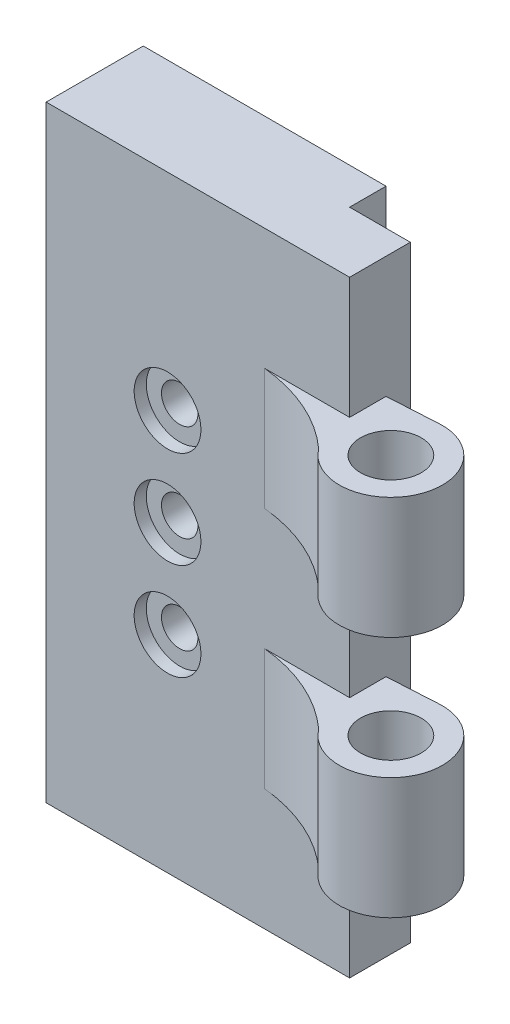
ISO-10303-21;
HEADER;
FILE_DESCRIPTION(('STEP AP214'),'2;1');
FILE_NAME('part.step','',(''),(''),'','','');
FILE_SCHEMA(('AUTOMOTIVE_DESIGN { 1 0 10303 214 1 1 1 1 }'));
ENDSEC;
DATA;
#1=APPLICATION_CONTEXT('core data for automotive mechanical design processes');
#2=APPLICATION_PROTOCOL_DEFINITION('international standard','automotive_design',2000,#1);
#3=PRODUCT_CONTEXT('',#1,'mechanical');
#4=PRODUCT('Part','Part','',(#3));
#5=PRODUCT_RELATED_PRODUCT_CATEGORY('part','',(#4));
#6=PRODUCT_DEFINITION_FORMATION('','',#4);
#7=PRODUCT_DEFINITION_CONTEXT('part definition',#1,'design');
#8=PRODUCT_DEFINITION('design','',#6,#7);
#9=PRODUCT_DEFINITION_SHAPE('','',#8);
#10=(LENGTH_UNIT() NAMED_UNIT(*) SI_UNIT(.MILLI.,.METRE.));
#11=(NAMED_UNIT(*) PLANE_ANGLE_UNIT() SI_UNIT($,.RADIAN.));
#12=(NAMED_UNIT(*) SI_UNIT($,.STERADIAN.) SOLID_ANGLE_UNIT());
#13=UNCERTAINTY_MEASURE_WITH_UNIT(LENGTH_MEASURE(1.E-05),#10,'distance_accuracy_value','');
#14=(GEOMETRIC_REPRESENTATION_CONTEXT(3) GLOBAL_UNCERTAINTY_ASSIGNED_CONTEXT((#13)) GLOBAL_UNIT_ASSIGNED_CONTEXT((#10,
#11,#12)) REPRESENTATION_CONTEXT('',''));
#15=CARTESIAN_POINT('',(0.,0.,0.));
#16=DIRECTION('',(0.,0.,1.));
#17=DIRECTION('',(1.,0.,0.));
#18=AXIS2_PLACEMENT_3D('',#15,#16,#17);
#19=CARTESIAN_POINT('',(-17.5,-50.,-5.));
#20=DIRECTION('',(0.,0.,1.));
#21=DIRECTION('',(1.,0.,0.));
#22=AXIS2_PLACEMENT_3D('',#19,#20,#21);
#23=PLANE('',#22);
#24=DIRECTION('',(0.,-1.,0.));
#25=VECTOR('',#24,1.);
#26=CARTESIAN_POINT('',(-5.,-50.,-5.));
#27=LINE('',#26,#25);
#28=CARTESIAN_POINT('',(-5.,0.,-5.));
#29=VERTEX_POINT('',#28);
#30=CARTESIAN_POINT('',(-5.,-50.,-5.));
#31=VERTEX_POINT('',#30);
#32=EDGE_CURVE('E56',#29,#31,#27,.T.);
#33=ORIENTED_EDGE('',*,*,#32,.F.);
#34=DIRECTION('',(1.,0.,0.));
#35=VECTOR('',#34,1.);
#36=CARTESIAN_POINT('',(-17.5,0.,-5.));
#37=LINE('',#36,#35);
#38=CARTESIAN_POINT('',(0.,0.,-5.));
#39=VERTEX_POINT('',#38);
#40=EDGE_CURVE('E232',#29,#39,#37,.T.);
#41=ORIENTED_EDGE('',*,*,#40,.T.);
#42=DIRECTION('',(0.,1.,0.));
#43=VECTOR('',#42,1.);
#44=CARTESIAN_POINT('',(0.,-50.,-5.));
#45=LINE('',#44,#43);
#46=CARTESIAN_POINT('',(0.,-50.,-5.));
#47=VERTEX_POINT('',#46);
#48=EDGE_CURVE('E181',#47,#39,#45,.T.);
#49=ORIENTED_EDGE('',*,*,#48,.F.);
#50=DIRECTION('',(1.,0.,0.));
#51=VECTOR('',#50,1.);
#52=CARTESIAN_POINT('',(-17.5,-50.,-5.));
#53=LINE('',#52,#51);
#54=EDGE_CURVE('E240',#31,#47,#53,.T.);
#55=ORIENTED_EDGE('',*,*,#54,.F.);
#56=EDGE_LOOP('',(#33,#41,#49,#55));
#57=FACE_BOUND('',#56,.T.);
#58=ADVANCED_FACE('F39',(#57),#23,.F.);
#59=CARTESIAN_POINT('',(-17.5,-50.,0.));
#60=DIRECTION('',(0.,0.,-1.));
#61=DIRECTION('',(-1.,0.,0.));
#62=AXIS2_PLACEMENT_3D('',#59,#60,#61);
#63=PLANE('',#62);
#64=CARTESIAN_POINT('',(-15.,-17.,0.));
#65=DIRECTION('',(0.,0.,1.));
#66=DIRECTION('',(1.,0.,0.));
#67=AXIS2_PLACEMENT_3D('',#64,#65,#66);
#68=CIRCLE('',#67,2.75);
#69=CARTESIAN_POINT('',(-12.25,-17.,0.));
#70=VERTEX_POINT('',#69);
#71=EDGE_CURVE('E11',#70,#70,#68,.T.);
#72=ORIENTED_EDGE('',*,*,#71,.F.);
#73=EDGE_LOOP('',(#72));
#74=FACE_BOUND('',#73,.T.);
#75=CARTESIAN_POINT('',(-15.,-25.,0.));
#76=DIRECTION('',(0.,0.,1.));
#77=DIRECTION('',(1.,0.,0.));
#78=AXIS2_PLACEMENT_3D('',#75,#76,#77);
#79=CIRCLE('',#78,2.75);
#80=CARTESIAN_POINT('',(-12.25,-25.,0.));
#81=VERTEX_POINT('',#80);
#82=EDGE_CURVE('E48',#81,#81,#79,.T.);
#83=ORIENTED_EDGE('',*,*,#82,.F.);
#84=EDGE_LOOP('',(#83));
#85=FACE_BOUND('',#84,.T.);
#86=CARTESIAN_POINT('',(-15.,-33.,0.));
#87=DIRECTION('',(0.,0.,1.));
#88=DIRECTION('',(1.,0.,0.));
#89=AXIS2_PLACEMENT_3D('',#86,#87,#88);
#90=CIRCLE('',#89,2.75);
#91=CARTESIAN_POINT('',(-12.25,-33.,0.));
#92=VERTEX_POINT('',#91);
#93=EDGE_CURVE('E306',#92,#92,#90,.T.);
#94=ORIENTED_EDGE('',*,*,#93,.F.);
#95=EDGE_LOOP('',(#94));
#96=FACE_BOUND('',#95,.T.);
#97=DIRECTION('',(-1.,0.,0.));
#98=VECTOR('',#97,1.);
#99=CARTESIAN_POINT('',(-17.5,0.,0.));
#100=LINE('',#99,#98);
#101=CARTESIAN_POINT('',(0.,0.,0.));
#102=VERTEX_POINT('',#101);
#103=CARTESIAN_POINT('',(-25.,0.,0.));
#104=VERTEX_POINT('',#103);
#105=EDGE_CURVE('E64',#102,#104,#100,.T.);
#106=ORIENTED_EDGE('',*,*,#105,.T.);
#107=DIRECTION('',(0.,-1.,0.));
#108=VECTOR('',#107,1.);
#109=CARTESIAN_POINT('',(-25.,-25.,0.));
#110=LINE('',#109,#108);
#111=CARTESIAN_POINT('',(-25.,-50.,0.));
#112=VERTEX_POINT('',#111);
#113=EDGE_CURVE('E303',#104,#112,#110,.T.);
#114=ORIENTED_EDGE('',*,*,#113,.T.);
#115=DIRECTION('',(-1.,0.,0.));
#116=VECTOR('',#115,1.);
#117=CARTESIAN_POINT('',(-17.5,-50.,0.));
#118=LINE('',#117,#116);
#119=CARTESIAN_POINT('',(0.,-50.,0.));
#120=VERTEX_POINT('',#119);
#121=EDGE_CURVE('E301',#120,#112,#118,.T.);
#122=ORIENTED_EDGE('',*,*,#121,.F.);
#123=DIRECTION('',(0.,1.,0.));
#124=VECTOR('',#123,1.);
#125=CARTESIAN_POINT('',(0.,-50.,0.));
#126=LINE('',#125,#124);
#127=CARTESIAN_POINT('',(0.,-40.,0.));
#128=VERTEX_POINT('',#127);
#129=EDGE_CURVE('E299',#120,#128,#126,.T.);
#130=ORIENTED_EDGE('',*,*,#129,.T.);
#131=DIRECTION('',(1.,0.,0.));
#132=VECTOR('',#131,1.);
#133=CARTESIAN_POINT('',(-3.5,-40.,0.));
#134=LINE('',#133,#132);
#135=CARTESIAN_POINT('',(-7.,-40.,0.));
#136=VERTEX_POINT('',#135);
#137=EDGE_CURVE('E296',#136,#128,#134,.T.);
#138=ORIENTED_EDGE('',*,*,#137,.F.);
#139=DIRECTION('',(0.,-1.,0.));
#140=VECTOR('',#139,1.);
#141=CARTESIAN_POINT('',(-7.,-30.,0.));
#142=LINE('',#141,#140);
#143=CARTESIAN_POINT('',(-7.,-30.,0.));
#144=VERTEX_POINT('',#143);
#145=EDGE_CURVE('E293',#144,#136,#142,.T.);
#146=ORIENTED_EDGE('',*,*,#145,.F.);
#147=DIRECTION('',(1.,0.,0.));
#148=VECTOR('',#147,1.);
#149=CARTESIAN_POINT('',(-3.5,-30.,0.));
#150=LINE('',#149,#148);
#151=CARTESIAN_POINT('',(0.,-30.,0.));
#152=VERTEX_POINT('',#151);
#153=EDGE_CURVE('E291',#144,#152,#150,.T.);
#154=ORIENTED_EDGE('',*,*,#153,.T.);
#155=DIRECTION('',(0.,-1.,0.));
#156=VECTOR('',#155,1.);
#157=CARTESIAN_POINT('',(0.,-50.,0.));
#158=LINE('',#157,#156);
#159=CARTESIAN_POINT('',(0.,-20.,0.));
#160=VERTEX_POINT('',#159);
#161=EDGE_CURVE('E288',#160,#152,#158,.T.);
#162=ORIENTED_EDGE('',*,*,#161,.F.);
#163=DIRECTION('',(1.,0.,0.));
#164=VECTOR('',#163,1.);
#165=CARTESIAN_POINT('',(-3.5,-20.,0.));
#166=LINE('',#165,#164);
#167=CARTESIAN_POINT('',(-7.,-20.,0.));
#168=VERTEX_POINT('',#167);
#169=EDGE_CURVE('E285',#168,#160,#166,.T.);
#170=ORIENTED_EDGE('',*,*,#169,.F.);
#171=DIRECTION('',(0.,-1.,0.));
#172=VECTOR('',#171,1.);
#173=CARTESIAN_POINT('',(-7.,-10.,0.));
#174=LINE('',#173,#172);
#175=CARTESIAN_POINT('',(-7.,-10.,0.));
#176=VERTEX_POINT('',#175);
#177=EDGE_CURVE('E282',#176,#168,#174,.T.);
#178=ORIENTED_EDGE('',*,*,#177,.F.);
#179=DIRECTION('',(1.,0.,0.));
#180=VECTOR('',#179,1.);
#181=CARTESIAN_POINT('',(-3.5,-10.,0.));
#182=LINE('',#181,#180);
#183=CARTESIAN_POINT('',(0.,-10.,0.));
#184=VERTEX_POINT('',#183);
#185=EDGE_CURVE('E280',#176,#184,#182,.T.);
#186=ORIENTED_EDGE('',*,*,#185,.T.);
#187=DIRECTION('',(0.,-1.,0.));
#188=VECTOR('',#187,1.);
#189=CARTESIAN_POINT('',(0.,-50.,0.));
#190=LINE('',#189,#188);
#191=EDGE_CURVE('E277',#102,#184,#190,.T.);
#192=ORIENTED_EDGE('',*,*,#191,.F.);
#193=EDGE_LOOP('',(#106,#114,#122,#130,#138,#146,#154,#162,#170,#178,#186,#192));
#194=FACE_BOUND('',#193,.T.);
#195=ADVANCED_FACE('F41',(#74,#85,#96,#194),#63,.F.);
#196=CARTESIAN_POINT('',(2.07596786739447,-50.,-3.12137715413392));
#197=DIRECTION('',(0.0583680624026018,0.,0.998295131357138));
#198=DIRECTION('',(0.998295131357138,0.,-0.0583680624026018));
#199=AXIS2_PLACEMENT_3D('',#196,#197,#198);
#200=PLANE('',#199);
#201=DIRECTION('',(-0.998295131357138,0.,0.0583680624026018));
#202=VECTOR('',#201,1.);
#203=CARTESIAN_POINT('',(2.07596786739446,-10.,-3.12137715413392));
#204=LINE('',#203,#202);
#205=CARTESIAN_POINT('',(4.15193573478895,-10.,-3.24275430826783));
#206=VERTEX_POINT('',#205);
#207=CARTESIAN_POINT('',(0.,-10.,-3.));
#208=VERTEX_POINT('',#207);
#209=EDGE_CURVE('E274',#206,#208,#204,.T.);
#210=ORIENTED_EDGE('',*,*,#209,.F.);
#211=DIRECTION('',(0.,1.,0.));
#212=VECTOR('',#211,1.);
#213=CARTESIAN_POINT('',(4.15193573478895,-50.,-3.24275430826784));
#214=LINE('',#213,#212);
#215=CARTESIAN_POINT('',(4.15193573478895,-20.,-3.24275430826783));
#216=VERTEX_POINT('',#215);
#217=EDGE_CURVE('E271',#216,#206,#214,.T.);
#218=ORIENTED_EDGE('',*,*,#217,.F.);
#219=DIRECTION('',(0.998295131357138,0.,-0.0583680624026018));
#220=VECTOR('',#219,1.);
#221=CARTESIAN_POINT('',(2.07596786739447,-20.,-3.12137715413392));
#222=LINE('',#221,#220);
#223=CARTESIAN_POINT('',(0.,-20.,-3.));
#224=VERTEX_POINT('',#223);
#225=EDGE_CURVE('E268',#224,#216,#222,.T.);
#226=ORIENTED_EDGE('',*,*,#225,.F.);
#227=DIRECTION('',(0.,1.,0.));
#228=VECTOR('',#227,1.);
#229=CARTESIAN_POINT('',(0.,-50.,-3.));
#230=LINE('',#229,#228);
#231=EDGE_CURVE('E266',#224,#208,#230,.T.);
#232=ORIENTED_EDGE('',*,*,#231,.T.);
#233=EDGE_LOOP('',(#210,#218,#226,#232));
#234=FACE_BOUND('',#233,.T.);
#235=ADVANCED_FACE('F342',(#234),#200,.F.);
#236=DIRECTION('',(-0.998295131357138,0.,0.0583680624026018));
#237=VECTOR('',#236,1.);
#238=CARTESIAN_POINT('',(2.07596786739446,-30.,-3.12137715413392));
#239=LINE('',#238,#237);
#240=CARTESIAN_POINT('',(4.15193573478895,-30.,-3.24275430826783));
#241=VERTEX_POINT('',#240);
#242=CARTESIAN_POINT('',(0.,-30.,-3.));
#243=VERTEX_POINT('',#242);
#244=EDGE_CURVE('E263',#241,#243,#239,.T.);
#245=ORIENTED_EDGE('',*,*,#244,.F.);
#246=CARTESIAN_POINT('',(4.15193573478895,-40.,-3.24275430826784));
#247=VERTEX_POINT('',#246);
#248=EDGE_CURVE('E262',#247,#241,#214,.T.);
#249=ORIENTED_EDGE('',*,*,#248,.F.);
#250=DIRECTION('',(-0.998295131357138,0.,0.0583680624026018));
#251=VECTOR('',#250,1.);
#252=CARTESIAN_POINT('',(2.07596786739447,-40.,-3.12137715413392));
#253=LINE('',#252,#251);
#254=CARTESIAN_POINT('',(0.,-40.,-3.));
#255=VERTEX_POINT('',#254);
#256=EDGE_CURVE('E260',#247,#255,#253,.T.);
#257=ORIENTED_EDGE('',*,*,#256,.T.);
#258=EDGE_CURVE('E259',#255,#243,#230,.T.);
#259=ORIENTED_EDGE('',*,*,#258,.T.);
#260=EDGE_LOOP('',(#245,#249,#257,#259));
#261=FACE_BOUND('',#260,.T.);
#262=ADVANCED_FACE('F347',(#261),#200,.F.);
#263=CARTESIAN_POINT('',(4.4,-50.,1.));
#264=DIRECTION('',(0.,1.,0.));
#265=DIRECTION('',(0.,0.,1.));
#266=AXIS2_PLACEMENT_3D('',#263,#264,#265);
#267=CYLINDRICAL_SURFACE('',#266,4.25);
#268=CARTESIAN_POINT('',(4.4,-10.,1.));
#269=DIRECTION('',(0.,1.,0.));
#270=DIRECTION('',(-1.,0.,0.));
#271=AXIS2_PLACEMENT_3D('',#268,#269,#270);
#272=CIRCLE('',#271,4.25);
#273=CARTESIAN_POINT('',(0.982652763357696,-10.,3.5267049420566));
#274=VERTEX_POINT('',#273);
#275=EDGE_CURVE('E256',#274,#206,#272,.T.);
#276=ORIENTED_EDGE('',*,*,#275,.F.);
#277=DIRECTION('',(0.,-1.,0.));
#278=VECTOR('',#277,1.);
#279=CARTESIAN_POINT('',(0.982652763357696,-10.,3.5267049420566));
#280=LINE('',#279,#278);
#281=CARTESIAN_POINT('',(0.982652763357696,-20.,3.5267049420566));
#282=VERTEX_POINT('',#281);
#283=EDGE_CURVE('E254',#274,#282,#280,.T.);
#284=ORIENTED_EDGE('',*,*,#283,.T.);
#285=CARTESIAN_POINT('',(4.4,-20.,1.));
#286=DIRECTION('',(0.,-1.,0.));
#287=DIRECTION('',(0.,0.,-1.));
#288=AXIS2_PLACEMENT_3D('',#285,#286,#287);
#289=CIRCLE('',#288,4.25);
#290=EDGE_CURVE('E251',#216,#282,#289,.T.);
#291=ORIENTED_EDGE('',*,*,#290,.F.);
#292=ORIENTED_EDGE('',*,*,#217,.T.);
#293=EDGE_LOOP('',(#276,#284,#291,#292));
#294=FACE_BOUND('',#293,.T.);
#295=ADVANCED_FACE('F378',(#294),#267,.T.);
#296=CARTESIAN_POINT('',(4.4,-30.,1.));
#297=DIRECTION('',(0.,1.,0.));
#298=DIRECTION('',(-1.,0.,0.));
#299=AXIS2_PLACEMENT_3D('',#296,#297,#298);
#300=CIRCLE('',#299,4.25);
#301=CARTESIAN_POINT('',(0.981325144241788,-30.,3.52490836083344));
#302=VERTEX_POINT('',#301);
#303=EDGE_CURVE('E248',#302,#241,#300,.T.);
#304=ORIENTED_EDGE('',*,*,#303,.F.);
#305=DIRECTION('',(0.,-1.,0.));
#306=VECTOR('',#305,1.);
#307=CARTESIAN_POINT('',(0.981325144241788,-30.,3.52490836083344));
#308=LINE('',#307,#306);
#309=CARTESIAN_POINT('',(0.981325144241788,-40.,3.52490836083344));
#310=VERTEX_POINT('',#309);
#311=EDGE_CURVE('E246',#302,#310,#308,.T.);
#312=ORIENTED_EDGE('',*,*,#311,.T.);
#313=CARTESIAN_POINT('',(4.4,-40.,1.));
#314=DIRECTION('',(0.,1.,0.));
#315=DIRECTION('',(0.,0.,1.));
#316=AXIS2_PLACEMENT_3D('',#313,#314,#315);
#317=CIRCLE('',#316,4.25);
#318=EDGE_CURVE('E243',#310,#247,#317,.T.);
#319=ORIENTED_EDGE('',*,*,#318,.T.);
#320=ORIENTED_EDGE('',*,*,#248,.T.);
#321=EDGE_LOOP('',(#304,#312,#319,#320));
#322=FACE_BOUND('',#321,.T.);
#323=ADVANCED_FACE('F376',(#322),#267,.T.);
#324=CARTESIAN_POINT('',(-13.175,-50.,1.));
#325=DIRECTION('',(0.,-1.,0.));
#326=DIRECTION('',(1.,0.,0.));
#327=AXIS2_PLACEMENT_3D('',#324,#325,#326);
#328=PLANE('',#327);
#329=DIRECTION('',(0.,0.,1.));
#330=VECTOR('',#329,1.);
#331=CARTESIAN_POINT('',(-25.,-50.,-25.));
#332=LINE('',#331,#330);
#333=CARTESIAN_POINT('',(-25.,-50.,-8.));
#334=VERTEX_POINT('',#333);
#335=EDGE_CURVE('E161',#334,#112,#332,.T.);
#336=ORIENTED_EDGE('',*,*,#335,.F.);
#337=DIRECTION('',(-1.,0.,0.));
#338=VECTOR('',#337,1.);
#339=CARTESIAN_POINT('',(-5.,-50.,-8.));
#340=LINE('',#339,#338);
#341=CARTESIAN_POINT('',(-5.,-50.,-8.));
#342=VERTEX_POINT('',#341);
#343=EDGE_CURVE('E154',#342,#334,#340,.T.);
#344=ORIENTED_EDGE('',*,*,#343,.F.);
#345=DIRECTION('',(0.,0.,1.));
#346=VECTOR('',#345,1.);
#347=CARTESIAN_POINT('',(-5.,-50.,-8.));
#348=LINE('',#347,#346);
#349=EDGE_CURVE('E158',#342,#31,#348,.T.);
#350=ORIENTED_EDGE('',*,*,#349,.T.);
#351=ORIENTED_EDGE('',*,*,#54,.T.);
#352=DIRECTION('',(0.,0.,1.));
#353=VECTOR('',#352,1.);
#354=CARTESIAN_POINT('',(0.,-50.,-12.5));
#355=LINE('',#354,#353);
#356=EDGE_CURVE('E237',#47,#120,#355,.T.);
#357=ORIENTED_EDGE('',*,*,#356,.T.);
#358=ORIENTED_EDGE('',*,*,#121,.T.);
#359=EDGE_LOOP('',(#336,#344,#350,#351,#357,#358));
#360=FACE_BOUND('',#359,.T.);
#361=ADVANCED_FACE('F156',(#360),#328,.T.);
#362=CARTESIAN_POINT('',(-13.175,0.,1.));
#363=DIRECTION('',(0.,-1.,0.));
#364=DIRECTION('',(1.,0.,0.));
#365=AXIS2_PLACEMENT_3D('',#362,#363,#364);
#366=PLANE('',#365);
#367=DIRECTION('',(0.,0.,1.));
#368=VECTOR('',#367,1.);
#369=CARTESIAN_POINT('',(0.,0.,-12.5));
#370=LINE('',#369,#368);
#371=EDGE_CURVE('E234',#39,#102,#370,.T.);
#372=ORIENTED_EDGE('',*,*,#371,.F.);
#373=ORIENTED_EDGE('',*,*,#40,.F.);
#374=DIRECTION('',(0.,0.,1.));
#375=VECTOR('',#374,1.);
#376=CARTESIAN_POINT('',(-5.,0.,-8.));
#377=LINE('',#376,#375);
#378=CARTESIAN_POINT('',(-5.,0.,-8.));
#379=VERTEX_POINT('',#378);
#380=EDGE_CURVE('E178',#379,#29,#377,.T.);
#381=ORIENTED_EDGE('',*,*,#380,.F.);
#382=DIRECTION('',(1.,0.,0.));
#383=VECTOR('',#382,1.);
#384=CARTESIAN_POINT('',(-5.,0.,-8.));
#385=LINE('',#384,#383);
#386=CARTESIAN_POINT('',(-25.,0.,-8.));
#387=VERTEX_POINT('',#386);
#388=EDGE_CURVE('E171',#387,#379,#385,.T.);
#389=ORIENTED_EDGE('',*,*,#388,.F.);
#390=DIRECTION('',(0.,0.,1.));
#391=VECTOR('',#390,1.);
#392=CARTESIAN_POINT('',(-25.,0.,-25.));
#393=LINE('',#392,#391);
#394=EDGE_CURVE('E230',#387,#104,#393,.T.);
#395=ORIENTED_EDGE('',*,*,#394,.T.);
#396=ORIENTED_EDGE('',*,*,#105,.F.);
#397=EDGE_LOOP('',(#372,#373,#381,#389,#395,#396));
#398=FACE_BOUND('',#397,.T.);
#399=ADVANCED_FACE('F333',(#398),#366,.F.);
#400=CARTESIAN_POINT('',(-15.,-33.,-1.));
#401=DIRECTION('',(0.,0.,1.));
#402=DIRECTION('',(1.,0.,0.));
#403=AXIS2_PLACEMENT_3D('',#400,#401,#402);
#404=CYLINDRICAL_SURFACE('',#403,2.75);
#405=CARTESIAN_POINT('',(-15.,-33.,-1.));
#406=DIRECTION('',(0.,0.,1.));
#407=DIRECTION('',(1.,0.,0.));
#408=AXIS2_PLACEMENT_3D('',#405,#406,#407);
#409=CIRCLE('',#408,2.75);
#410=CARTESIAN_POINT('',(-12.25,-33.,-1.));
#411=VERTEX_POINT('',#410);
#412=EDGE_CURVE('E227',#411,#411,#409,.T.);
#413=ORIENTED_EDGE('',*,*,#412,.F.);
#414=EDGE_LOOP('',(#413));
#415=FACE_BOUND('',#414,.T.);
#416=ORIENTED_EDGE('',*,*,#93,.T.);
#417=EDGE_LOOP('',(#416));
#418=FACE_BOUND('',#417,.T.);
#419=ADVANCED_FACE('F357',(#415,#418),#404,.F.);
#420=CARTESIAN_POINT('',(-17.5,-25.,-1.));
#421=DIRECTION('',(0.,0.,1.));
#422=DIRECTION('',(1.,0.,0.));
#423=AXIS2_PLACEMENT_3D('',#420,#421,#422);
#424=PLANE('',#423);
#425=CARTESIAN_POINT('',(-15.,-33.,-1.));
#426=DIRECTION('',(0.,0.,1.));
#427=DIRECTION('',(1.,0.,0.));
#428=AXIS2_PLACEMENT_3D('',#425,#426,#427);
#429=CIRCLE('',#428,1.5);
#430=CARTESIAN_POINT('',(-13.5,-33.,-1.));
#431=VERTEX_POINT('',#430);
#432=EDGE_CURVE('E313',#431,#431,#429,.F.);
#433=ORIENTED_EDGE('',*,*,#432,.T.);
#434=EDGE_LOOP('',(#433));
#435=FACE_BOUND('',#434,.T.);
#436=ORIENTED_EDGE('',*,*,#412,.T.);
#437=EDGE_LOOP('',(#436));
#438=FACE_BOUND('',#437,.T.);
#439=ADVANCED_FACE('F359',(#435,#438),#424,.T.);
#440=CARTESIAN_POINT('',(-15.,-25.,-1.));
#441=DIRECTION('',(0.,0.,1.));
#442=DIRECTION('',(1.,0.,0.));
#443=AXIS2_PLACEMENT_3D('',#440,#441,#442);
#444=CYLINDRICAL_SURFACE('',#443,2.75);
#445=CARTESIAN_POINT('',(-15.,-25.,-1.));
#446=DIRECTION('',(0.,0.,1.));
#447=DIRECTION('',(1.,0.,0.));
#448=AXIS2_PLACEMENT_3D('',#445,#446,#447);
#449=CIRCLE('',#448,2.75);
#450=CARTESIAN_POINT('',(-12.25,-25.,-1.));
#451=VERTEX_POINT('',#450);
#452=EDGE_CURVE('E224',#451,#451,#449,.T.);
#453=ORIENTED_EDGE('',*,*,#452,.F.);
#454=EDGE_LOOP('',(#453));
#455=FACE_BOUND('',#454,.T.);
#456=ORIENTED_EDGE('',*,*,#82,.T.);
#457=EDGE_LOOP('',(#456));
#458=FACE_BOUND('',#457,.T.);
#459=ADVANCED_FACE('F367',(#455,#458),#444,.F.);
#460=CARTESIAN_POINT('',(-17.5,-25.,-1.));
#461=DIRECTION('',(0.,0.,1.));
#462=DIRECTION('',(1.,0.,0.));
#463=AXIS2_PLACEMENT_3D('',#460,#461,#462);
#464=PLANE('',#463);
#465=CARTESIAN_POINT('',(-15.,-25.,-1.));
#466=DIRECTION('',(0.,0.,1.));
#467=DIRECTION('',(1.,0.,0.));
#468=AXIS2_PLACEMENT_3D('',#465,#466,#467);
#469=CIRCLE('',#468,1.5);
#470=CARTESIAN_POINT('',(-13.5,-25.,-1.));
#471=VERTEX_POINT('',#470);
#472=EDGE_CURVE('E316',#471,#471,#469,.F.);
#473=ORIENTED_EDGE('',*,*,#472,.T.);
#474=EDGE_LOOP('',(#473));
#475=FACE_BOUND('',#474,.T.);
#476=ORIENTED_EDGE('',*,*,#452,.T.);
#477=EDGE_LOOP('',(#476));
#478=FACE_BOUND('',#477,.T.);
#479=ADVANCED_FACE('F462',(#475,#478),#464,.T.);
#480=CARTESIAN_POINT('',(-15.,-17.,-1.));
#481=DIRECTION('',(0.,0.,1.));
#482=DIRECTION('',(1.,0.,0.));
#483=AXIS2_PLACEMENT_3D('',#480,#481,#482);
#484=CYLINDRICAL_SURFACE('',#483,2.75);
#485=CARTESIAN_POINT('',(-15.,-17.,-1.));
#486=DIRECTION('',(0.,0.,1.));
#487=DIRECTION('',(1.,0.,0.));
#488=AXIS2_PLACEMENT_3D('',#485,#486,#487);
#489=CIRCLE('',#488,2.75);
#490=CARTESIAN_POINT('',(-12.25,-17.,-1.));
#491=VERTEX_POINT('',#490);
#492=EDGE_CURVE('E221',#491,#491,#489,.T.);
#493=ORIENTED_EDGE('',*,*,#492,.F.);
#494=EDGE_LOOP('',(#493));
#495=FACE_BOUND('',#494,.T.);
#496=ORIENTED_EDGE('',*,*,#71,.T.);
#497=EDGE_LOOP('',(#496));
#498=FACE_BOUND('',#497,.T.);
#499=ADVANCED_FACE('F456',(#495,#498),#484,.F.);
#500=CARTESIAN_POINT('',(-17.5,-25.,-1.));
#501=DIRECTION('',(0.,0.,1.));
#502=DIRECTION('',(1.,0.,0.));
#503=AXIS2_PLACEMENT_3D('',#500,#501,#502);
#504=PLANE('',#503);
#505=CARTESIAN_POINT('',(-15.,-17.,-1.));
#506=DIRECTION('',(0.,0.,1.));
#507=DIRECTION('',(1.,0.,0.));
#508=AXIS2_PLACEMENT_3D('',#505,#506,#507);
#509=CIRCLE('',#508,1.5);
#510=CARTESIAN_POINT('',(-13.5,-17.,-1.));
#511=VERTEX_POINT('',#510);
#512=EDGE_CURVE('E326',#511,#511,#509,.F.);
#513=ORIENTED_EDGE('',*,*,#512,.T.);
#514=EDGE_LOOP('',(#513));
#515=FACE_BOUND('',#514,.T.);
#516=ORIENTED_EDGE('',*,*,#492,.T.);
#517=EDGE_LOOP('',(#516));
#518=FACE_BOUND('',#517,.T.);
#519=ADVANCED_FACE('F447',(#515,#518),#504,.T.);
#520=CARTESIAN_POINT('',(13.5,-40.,-12.5));
#521=DIRECTION('',(0.,1.,0.));
#522=DIRECTION('',(0.,0.,1.));
#523=AXIS2_PLACEMENT_3D('',#520,#521,#522);
#524=PLANE('',#523);
#525=ORIENTED_EDGE('',*,*,#137,.T.);
#526=DIRECTION('',(0.,0.,1.));
#527=VECTOR('',#526,1.);
#528=CARTESIAN_POINT('',(0.,-40.,-12.5));
#529=LINE('',#528,#527);
#530=EDGE_CURVE('E218',#255,#128,#529,.T.);
#531=ORIENTED_EDGE('',*,*,#530,.F.);
#532=ORIENTED_EDGE('',*,*,#256,.F.);
#533=ORIENTED_EDGE('',*,*,#318,.F.);
#534=CARTESIAN_POINT('',(-8.3700162508407,-40.,13.9004493564932));
#535=DIRECTION('',(0.,-1.,0.));
#536=DIRECTION('',(0.,0.,-1.));
#537=AXIS2_PLACEMENT_3D('',#534,#535,#536);
#538=CIRCLE('',#537,13.9678);
#539=EDGE_CURVE('E215',#136,#310,#538,.T.);
#540=ORIENTED_EDGE('',*,*,#539,.F.);
#541=EDGE_LOOP('',(#525,#531,#532,#533,#540));
#542=FACE_BOUND('',#541,.T.);
#543=CARTESIAN_POINT('',(4.4,-40.,1.));
#544=DIRECTION('',(0.,1.,0.));
#545=DIRECTION('',(0.,0.,1.));
#546=AXIS2_PLACEMENT_3D('',#543,#544,#545);
#547=CIRCLE('',#546,2.5);
#548=CARTESIAN_POINT('',(4.4,-40.,3.5));
#549=VERTEX_POINT('',#548);
#550=EDGE_CURVE('E212',#549,#549,#547,.T.);
#551=ORIENTED_EDGE('',*,*,#550,.T.);
#552=EDGE_LOOP('',(#551));
#553=FACE_BOUND('',#552,.T.);
#554=ADVANCED_FACE('F401',(#542,#553),#524,.F.);
#555=CARTESIAN_POINT('',(13.5,-20.,-12.5));
#556=DIRECTION('',(0.,-1.,0.));
#557=DIRECTION('',(0.,0.,-1.));
#558=AXIS2_PLACEMENT_3D('',#555,#556,#557);
#559=PLANE('',#558);
#560=CARTESIAN_POINT('',(4.4,-20.,1.));
#561=DIRECTION('',(0.,-1.,0.));
#562=DIRECTION('',(0.,0.,-1.));
#563=AXIS2_PLACEMENT_3D('',#560,#561,#562);
#564=CIRCLE('',#563,2.5);
#565=CARTESIAN_POINT('',(4.4,-20.,-1.5));
#566=VERTEX_POINT('',#565);
#567=EDGE_CURVE('E209',#566,#566,#564,.T.);
#568=ORIENTED_EDGE('',*,*,#567,.F.);
#569=EDGE_LOOP('',(#568));
#570=FACE_BOUND('',#569,.T.);
#571=DIRECTION('',(0.,0.,1.));
#572=VECTOR('',#571,1.);
#573=CARTESIAN_POINT('',(0.,-20.,-12.5));
#574=LINE('',#573,#572);
#575=EDGE_CURVE('E206',#224,#160,#574,.T.);
#576=ORIENTED_EDGE('',*,*,#575,.F.);
#577=ORIENTED_EDGE('',*,*,#225,.T.);
#578=ORIENTED_EDGE('',*,*,#290,.T.);
#579=CARTESIAN_POINT('',(-8.37076327789074,-20.,13.9003757098859));
#580=DIRECTION('',(0.,-1.,0.));
#581=DIRECTION('',(0.,0.,-1.));
#582=AXIS2_PLACEMENT_3D('',#579,#580,#581);
#583=CIRCLE('',#582,13.9678);
#584=EDGE_CURVE('E203',#168,#282,#583,.T.);
#585=ORIENTED_EDGE('',*,*,#584,.F.);
#586=ORIENTED_EDGE('',*,*,#169,.T.);
#587=EDGE_LOOP('',(#576,#577,#578,#585,#586));
#588=FACE_BOUND('',#587,.T.);
#589=ADVANCED_FACE('F408',(#570,#588),#559,.T.);
#590=CARTESIAN_POINT('',(13.5,-30.,-12.5));
#591=DIRECTION('',(0.,1.,0.));
#592=DIRECTION('',(-1.,0.,0.));
#593=AXIS2_PLACEMENT_3D('',#590,#591,#592);
#594=PLANE('',#593);
#595=DIRECTION('',(0.,0.,1.));
#596=VECTOR('',#595,1.);
#597=CARTESIAN_POINT('',(0.,-30.,-12.5));
#598=LINE('',#597,#596);
#599=EDGE_CURVE('E200',#243,#152,#598,.T.);
#600=ORIENTED_EDGE('',*,*,#599,.T.);
#601=ORIENTED_EDGE('',*,*,#153,.F.);
#602=CARTESIAN_POINT('',(-8.3700162508407,-30.,13.9004493564932));
#603=DIRECTION('',(0.,-1.,0.));
#604=DIRECTION('',(0.,0.,-1.));
#605=AXIS2_PLACEMENT_3D('',#602,#603,#604);
#606=CIRCLE('',#605,13.9678);
#607=EDGE_CURVE('E197',#144,#302,#606,.T.);
#608=ORIENTED_EDGE('',*,*,#607,.T.);
#609=ORIENTED_EDGE('',*,*,#303,.T.);
#610=ORIENTED_EDGE('',*,*,#244,.T.);
#611=EDGE_LOOP('',(#600,#601,#608,#609,#610));
#612=FACE_BOUND('',#611,.T.);
#613=CARTESIAN_POINT('',(4.4,-30.,1.));
#614=DIRECTION('',(0.,1.,0.));
#615=DIRECTION('',(-1.,0.,0.));
#616=AXIS2_PLACEMENT_3D('',#613,#614,#615);
#617=CIRCLE('',#616,2.5);
#618=CARTESIAN_POINT('',(1.9,-30.,1.));
#619=VERTEX_POINT('',#618);
#620=EDGE_CURVE('E194',#619,#619,#617,.T.);
#621=ORIENTED_EDGE('',*,*,#620,.F.);
#622=EDGE_LOOP('',(#621));
#623=FACE_BOUND('',#622,.T.);
#624=ADVANCED_FACE('F392',(#612,#623),#594,.T.);
#625=CARTESIAN_POINT('',(4.4,-50.,1.));
#626=DIRECTION('',(0.,1.,0.));
#627=DIRECTION('',(0.,0.,1.));
#628=AXIS2_PLACEMENT_3D('',#625,#626,#627);
#629=CYLINDRICAL_SURFACE('',#628,2.5);
#630=ORIENTED_EDGE('',*,*,#567,.T.);
#631=EDGE_LOOP('',(#630));
#632=FACE_BOUND('',#631,.T.);
#633=CARTESIAN_POINT('',(4.4,-10.,1.));
#634=DIRECTION('',(0.,1.,0.));
#635=DIRECTION('',(-1.,0.,0.));
#636=AXIS2_PLACEMENT_3D('',#633,#634,#635);
#637=CIRCLE('',#636,2.5);
#638=CARTESIAN_POINT('',(1.9,-10.,1.));
#639=VERTEX_POINT('',#638);
#640=EDGE_CURVE('E191',#639,#639,#637,.T.);
#641=ORIENTED_EDGE('',*,*,#640,.T.);
#642=EDGE_LOOP('',(#641));
#643=FACE_BOUND('',#642,.T.);
#644=ADVANCED_FACE('F425',(#632,#643),#629,.F.);
#645=CARTESIAN_POINT('',(0.,-50.,-12.5));
#646=DIRECTION('',(1.,0.,0.));
#647=DIRECTION('',(0.,0.,-1.));
#648=AXIS2_PLACEMENT_3D('',#645,#646,#647);
#649=PLANE('',#648);
#650=ORIENTED_EDGE('',*,*,#191,.T.);
#651=DIRECTION('',(0.,0.,1.));
#652=VECTOR('',#651,1.);
#653=CARTESIAN_POINT('',(0.,-10.,-12.5));
#654=LINE('',#653,#652);
#655=EDGE_CURVE('E188',#208,#184,#654,.T.);
#656=ORIENTED_EDGE('',*,*,#655,.F.);
#657=ORIENTED_EDGE('',*,*,#231,.F.);
#658=ORIENTED_EDGE('',*,*,#575,.T.);
#659=ORIENTED_EDGE('',*,*,#161,.T.);
#660=ORIENTED_EDGE('',*,*,#599,.F.);
#661=ORIENTED_EDGE('',*,*,#258,.F.);
#662=ORIENTED_EDGE('',*,*,#530,.T.);
#663=ORIENTED_EDGE('',*,*,#129,.F.);
#664=ORIENTED_EDGE('',*,*,#356,.F.);
#665=ORIENTED_EDGE('',*,*,#48,.T.);
#666=ORIENTED_EDGE('',*,*,#371,.T.);
#667=EDGE_LOOP('',(#650,#656,#657,#658,#659,#660,#661,#662,#663,#664,#665,#666));
#668=FACE_BOUND('',#667,.T.);
#669=ADVANCED_FACE('F338',(#668),#649,.T.);
#670=CARTESIAN_POINT('',(13.5,-10.,-12.5));
#671=DIRECTION('',(0.,1.,0.));
#672=DIRECTION('',(-1.,0.,0.));
#673=AXIS2_PLACEMENT_3D('',#670,#671,#672);
#674=PLANE('',#673);
#675=ORIENTED_EDGE('',*,*,#655,.T.);
#676=ORIENTED_EDGE('',*,*,#185,.F.);
#677=CARTESIAN_POINT('',(-8.37076327789074,-10.,13.9003757098859));
#678=DIRECTION('',(0.,-1.,0.));
#679=DIRECTION('',(0.,0.,-1.));
#680=AXIS2_PLACEMENT_3D('',#677,#678,#679);
#681=CIRCLE('',#680,13.9678);
#682=EDGE_CURVE('E177',#176,#274,#681,.T.);
#683=ORIENTED_EDGE('',*,*,#682,.T.);
#684=ORIENTED_EDGE('',*,*,#275,.T.);
#685=ORIENTED_EDGE('',*,*,#209,.T.);
#686=EDGE_LOOP('',(#675,#676,#683,#684,#685));
#687=FACE_BOUND('',#686,.T.);
#688=ORIENTED_EDGE('',*,*,#640,.F.);
#689=EDGE_LOOP('',(#688));
#690=FACE_BOUND('',#689,.T.);
#691=ADVANCED_FACE('F416',(#687,#690),#674,.T.);
#692=ORIENTED_EDGE('',*,*,#550,.F.);
#693=EDGE_LOOP('',(#692));
#694=FACE_BOUND('',#693,.T.);
#695=ORIENTED_EDGE('',*,*,#620,.T.);
#696=EDGE_LOOP('',(#695));
#697=FACE_BOUND('',#696,.T.);
#698=ADVANCED_FACE('F421',(#694,#697),#629,.F.);
#699=CARTESIAN_POINT('',(-8.3700162508407,-30.,13.9004493564932));
#700=DIRECTION('',(0.,-1.,0.));
#701=DIRECTION('',(0.,0.,-1.));
#702=AXIS2_PLACEMENT_3D('',#699,#700,#701);
#703=CYLINDRICAL_SURFACE('',#702,13.9678);
#704=ORIENTED_EDGE('',*,*,#539,.T.);
#705=ORIENTED_EDGE('',*,*,#311,.F.);
#706=ORIENTED_EDGE('',*,*,#607,.F.);
#707=ORIENTED_EDGE('',*,*,#145,.T.);
#708=EDGE_LOOP('',(#704,#705,#706,#707));
#709=FACE_BOUND('',#708,.T.);
#710=ADVANCED_FACE('F398',(#709),#703,.F.);
#711=CARTESIAN_POINT('',(-8.37076327789074,-10.,13.9003757098859));
#712=DIRECTION('',(0.,-1.,0.));
#713=DIRECTION('',(0.,0.,-1.));
#714=AXIS2_PLACEMENT_3D('',#711,#712,#713);
#715=CYLINDRICAL_SURFACE('',#714,13.9678);
#716=ORIENTED_EDGE('',*,*,#584,.T.);
#717=ORIENTED_EDGE('',*,*,#283,.F.);
#718=ORIENTED_EDGE('',*,*,#682,.F.);
#719=ORIENTED_EDGE('',*,*,#177,.T.);
#720=EDGE_LOOP('',(#716,#717,#718,#719));
#721=FACE_BOUND('',#720,.T.);
#722=ADVANCED_FACE('F413',(#721),#715,.F.);
#723=CARTESIAN_POINT('',(-25.,-25.,-25.));
#724=DIRECTION('',(-1.,0.,0.));
#725=DIRECTION('',(0.,-1.,0.));
#726=AXIS2_PLACEMENT_3D('',#723,#724,#725);
#727=PLANE('',#726);
#728=ORIENTED_EDGE('',*,*,#394,.F.);
#729=DIRECTION('',(0.,1.,0.));
#730=VECTOR('',#729,1.);
#731=CARTESIAN_POINT('',(-25.,-50.,-8.));
#732=LINE('',#731,#730);
#733=EDGE_CURVE('E165',#334,#387,#732,.T.);
#734=ORIENTED_EDGE('',*,*,#733,.F.);
#735=ORIENTED_EDGE('',*,*,#335,.T.);
#736=ORIENTED_EDGE('',*,*,#113,.F.);
#737=EDGE_LOOP('',(#728,#734,#735,#736));
#738=FACE_BOUND('',#737,.T.);
#739=ADVANCED_FACE('F340',(#738),#727,.T.);
#740=CARTESIAN_POINT('',(0.,0.,-8.));
#741=DIRECTION('',(0.,0.,1.));
#742=DIRECTION('',(1.,0.,0.));
#743=AXIS2_PLACEMENT_3D('',#740,#741,#742);
#744=PLANE('',#743);
#745=CARTESIAN_POINT('',(-15.,-17.,-8.));
#746=DIRECTION('',(0.,0.,1.));
#747=DIRECTION('',(1.,0.,0.));
#748=AXIS2_PLACEMENT_3D('',#745,#746,#747);
#749=CIRCLE('',#748,1.5);
#750=CARTESIAN_POINT('',(-13.5,-17.,-8.));
#751=VERTEX_POINT('',#750);
#752=EDGE_CURVE('E43',#751,#751,#749,.F.);
#753=ORIENTED_EDGE('',*,*,#752,.F.);
#754=EDGE_LOOP('',(#753));
#755=FACE_BOUND('',#754,.T.);
#756=CARTESIAN_POINT('',(-15.,-25.,-8.));
#757=DIRECTION('',(0.,0.,1.));
#758=DIRECTION('',(1.,0.,0.));
#759=AXIS2_PLACEMENT_3D('',#756,#757,#758);
#760=CIRCLE('',#759,1.5);
#761=CARTESIAN_POINT('',(-13.5,-25.,-8.));
#762=VERTEX_POINT('',#761);
#763=EDGE_CURVE('E314',#762,#762,#760,.F.);
#764=ORIENTED_EDGE('',*,*,#763,.F.);
#765=EDGE_LOOP('',(#764));
#766=FACE_BOUND('',#765,.T.);
#767=CARTESIAN_POINT('',(-15.,-33.,-8.));
#768=DIRECTION('',(0.,0.,1.));
#769=DIRECTION('',(1.,0.,0.));
#770=AXIS2_PLACEMENT_3D('',#767,#768,#769);
#771=CIRCLE('',#770,1.5);
#772=CARTESIAN_POINT('',(-13.5,-33.,-8.));
#773=VERTEX_POINT('',#772);
#774=EDGE_CURVE('E311',#773,#773,#771,.F.);
#775=ORIENTED_EDGE('',*,*,#774,.F.);
#776=EDGE_LOOP('',(#775));
#777=FACE_BOUND('',#776,.T.);
#778=DIRECTION('',(0.,-1.,0.));
#779=VECTOR('',#778,1.);
#780=CARTESIAN_POINT('',(-5.,-50.,-8.));
#781=LINE('',#780,#779);
#782=EDGE_CURVE('E166',#379,#342,#781,.T.);
#783=ORIENTED_EDGE('',*,*,#782,.T.);
#784=ORIENTED_EDGE('',*,*,#343,.T.);
#785=ORIENTED_EDGE('',*,*,#733,.T.);
#786=ORIENTED_EDGE('',*,*,#388,.T.);
#787=EDGE_LOOP('',(#783,#784,#785,#786));
#788=FACE_BOUND('',#787,.T.);
#789=ADVANCED_FACE('F169',(#755,#766,#777,#788),#744,.F.);
#790=CARTESIAN_POINT('',(-5.,-50.,-8.));
#791=DIRECTION('',(-1.,0.,0.));
#792=DIRECTION('',(0.,0.,1.));
#793=AXIS2_PLACEMENT_3D('',#790,#791,#792);
#794=PLANE('',#793);
#795=ORIENTED_EDGE('',*,*,#32,.T.);
#796=ORIENTED_EDGE('',*,*,#349,.F.);
#797=ORIENTED_EDGE('',*,*,#782,.F.);
#798=ORIENTED_EDGE('',*,*,#380,.T.);
#799=EDGE_LOOP('',(#795,#796,#797,#798));
#800=FACE_BOUND('',#799,.T.);
#801=ADVANCED_FACE('F176',(#800),#794,.F.);
#802=CARTESIAN_POINT('',(-15.,-33.,13.));
#803=DIRECTION('',(0.,0.,-1.));
#804=DIRECTION('',(-1.,0.,0.));
#805=AXIS2_PLACEMENT_3D('',#802,#803,#804);
#806=CYLINDRICAL_SURFACE('',#805,1.5);
#807=ORIENTED_EDGE('',*,*,#432,.F.);
#808=EDGE_LOOP('',(#807));
#809=FACE_BOUND('',#808,.T.);
#810=ORIENTED_EDGE('',*,*,#774,.T.);
#811=EDGE_LOOP('',(#810));
#812=FACE_BOUND('',#811,.T.);
#813=ADVANCED_FACE('F528',(#809,#812),#806,.F.);
#814=CARTESIAN_POINT('',(-15.,-25.,13.));
#815=DIRECTION('',(0.,0.,-1.));
#816=DIRECTION('',(-1.,0.,0.));
#817=AXIS2_PLACEMENT_3D('',#814,#815,#816);
#818=CYLINDRICAL_SURFACE('',#817,1.5);
#819=ORIENTED_EDGE('',*,*,#472,.F.);
#820=EDGE_LOOP('',(#819));
#821=FACE_BOUND('',#820,.T.);
#822=ORIENTED_EDGE('',*,*,#763,.T.);
#823=EDGE_LOOP('',(#822));
#824=FACE_BOUND('',#823,.T.);
#825=ADVANCED_FACE('F555',(#821,#824),#818,.F.);
#826=CARTESIAN_POINT('',(-15.,-17.,13.));
#827=DIRECTION('',(0.,0.,-1.));
#828=DIRECTION('',(-1.,0.,0.));
#829=AXIS2_PLACEMENT_3D('',#826,#827,#828);
#830=CYLINDRICAL_SURFACE('',#829,1.5);
#831=ORIENTED_EDGE('',*,*,#512,.F.);
#832=EDGE_LOOP('',(#831));
#833=FACE_BOUND('',#832,.T.);
#834=ORIENTED_EDGE('',*,*,#752,.T.);
#835=EDGE_LOOP('',(#834));
#836=FACE_BOUND('',#835,.T.);
#837=ADVANCED_FACE('F565',(#833,#836),#830,.F.);
#838=CLOSED_SHELL('',(#58,#195,#235,#262,#295,#323,#361,#399,#419,#439,#459,#479,#499,#519,#554,
#589,#624,#644,#669,#691,#698,#710,#722,#739,#789,#801,#813,#825,#837));
#839=MANIFOLD_SOLID_BREP('B2',#838);
#840=ADVANCED_BREP_SHAPE_REPRESENTATION('',(#18,#839),#14);
#841=SHAPE_DEFINITION_REPRESENTATION(#9,#840);
ENDSEC;
END-ISO-10303-21;
